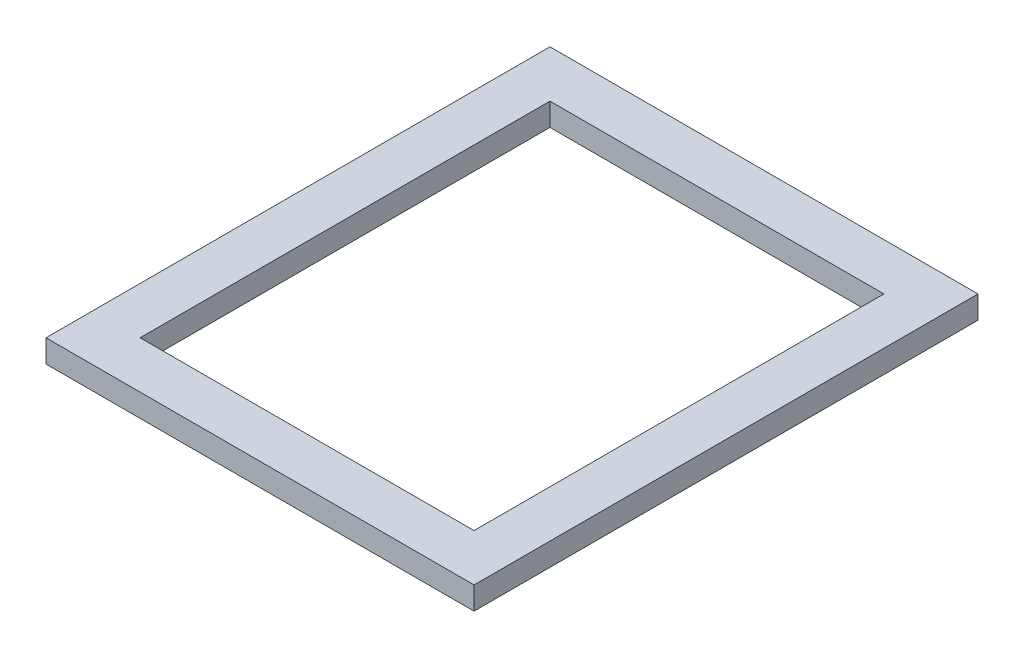
ISO-10303-21;
HEADER;
FILE_DESCRIPTION(('STEP AP214'),'2;1');
FILE_NAME('part.step','',(''),(''),'','','');
FILE_SCHEMA(('AUTOMOTIVE_DESIGN { 1 0 10303 214 1 1 1 1 }'));
ENDSEC;
DATA;
#1=APPLICATION_CONTEXT('core data for automotive mechanical design processes');
#2=APPLICATION_PROTOCOL_DEFINITION('international standard','automotive_design',2000,#1);
#3=PRODUCT_CONTEXT('',#1,'mechanical');
#4=PRODUCT('Part','Part','',(#3));
#5=PRODUCT_RELATED_PRODUCT_CATEGORY('part','',(#4));
#6=PRODUCT_DEFINITION_FORMATION('','',#4);
#7=PRODUCT_DEFINITION_CONTEXT('part definition',#1,'design');
#8=PRODUCT_DEFINITION('design','',#6,#7);
#9=PRODUCT_DEFINITION_SHAPE('','',#8);
#10=(LENGTH_UNIT() NAMED_UNIT(*) SI_UNIT(.MILLI.,.METRE.));
#11=(NAMED_UNIT(*) PLANE_ANGLE_UNIT() SI_UNIT($,.RADIAN.));
#12=(NAMED_UNIT(*) SI_UNIT($,.STERADIAN.) SOLID_ANGLE_UNIT());
#13=UNCERTAINTY_MEASURE_WITH_UNIT(LENGTH_MEASURE(1.E-05),#10,'distance_accuracy_value','');
#14=(GEOMETRIC_REPRESENTATION_CONTEXT(3) GLOBAL_UNCERTAINTY_ASSIGNED_CONTEXT((#13)) GLOBAL_UNIT_ASSIGNED_CONTEXT((#10,
#11,#12)) REPRESENTATION_CONTEXT('',''));
#15=CARTESIAN_POINT('',(0.,0.,0.));
#16=DIRECTION('',(0.,0.,1.));
#17=DIRECTION('',(1.,0.,0.));
#18=AXIS2_PLACEMENT_3D('',#15,#16,#17);
#19=CARTESIAN_POINT('',(0.,1.5,0.));
#20=DIRECTION('',(0.,1.,0.));
#21=DIRECTION('',(0.,0.,1.));
#22=AXIS2_PLACEMENT_3D('',#19,#20,#21);
#23=PLANE('',#22);
#24=DIRECTION('',(0.,0.,1.));
#25=VECTOR('',#24,1.);
#26=CARTESIAN_POINT('',(-14.1,1.5,-16.6));
#27=LINE('',#26,#25);
#28=CARTESIAN_POINT('',(-14.1,1.5,-16.6));
#29=VERTEX_POINT('',#28);
#30=CARTESIAN_POINT('',(-14.1,1.5,16.6));
#31=VERTEX_POINT('',#30);
#32=EDGE_CURVE('E145',#29,#31,#27,.T.);
#33=ORIENTED_EDGE('',*,*,#32,.T.);
#34=DIRECTION('',(1.,0.,0.));
#35=VECTOR('',#34,1.);
#36=CARTESIAN_POINT('',(-14.1,1.5,16.6));
#37=LINE('',#36,#35);
#38=CARTESIAN_POINT('',(14.1,1.5,16.6));
#39=VERTEX_POINT('',#38);
#40=EDGE_CURVE('E150',#31,#39,#37,.T.);
#41=ORIENTED_EDGE('',*,*,#40,.T.);
#42=DIRECTION('',(0.,0.,-1.));
#43=VECTOR('',#42,1.);
#44=CARTESIAN_POINT('',(14.1,1.5,16.6));
#45=LINE('',#44,#43);
#46=CARTESIAN_POINT('',(14.1,1.5,-16.6));
#47=VERTEX_POINT('',#46);
#48=EDGE_CURVE('E147',#39,#47,#45,.T.);
#49=ORIENTED_EDGE('',*,*,#48,.T.);
#50=DIRECTION('',(-1.,0.,0.));
#51=VECTOR('',#50,1.);
#52=CARTESIAN_POINT('',(14.1,1.5,-16.6));
#53=LINE('',#52,#51);
#54=EDGE_CURVE('E155',#47,#29,#53,.T.);
#55=ORIENTED_EDGE('',*,*,#54,.T.);
#56=EDGE_LOOP('',(#33,#41,#49,#55));
#57=FACE_BOUND('',#56,.T.);
#58=DIRECTION('',(1.,0.,0.));
#59=VECTOR('',#58,1.);
#60=CARTESIAN_POINT('',(-11.,1.5,13.5));
#61=LINE('',#60,#59);
#62=CARTESIAN_POINT('',(-11.,1.5,13.5));
#63=VERTEX_POINT('',#62);
#64=CARTESIAN_POINT('',(11.,1.5,13.5));
#65=VERTEX_POINT('',#64);
#66=EDGE_CURVE('E116',#63,#65,#61,.T.);
#67=ORIENTED_EDGE('',*,*,#66,.F.);
#68=DIRECTION('',(0.,0.,1.));
#69=VECTOR('',#68,1.);
#70=CARTESIAN_POINT('',(-11.,1.5,-13.5));
#71=LINE('',#70,#69);
#72=CARTESIAN_POINT('',(-11.,1.5,-13.5));
#73=VERTEX_POINT('',#72);
#74=EDGE_CURVE('E107',#73,#63,#71,.T.);
#75=ORIENTED_EDGE('',*,*,#74,.F.);
#76=DIRECTION('',(-1.,0.,0.));
#77=VECTOR('',#76,1.);
#78=CARTESIAN_POINT('',(11.,1.5,-13.5));
#79=LINE('',#78,#77);
#80=CARTESIAN_POINT('',(11.,1.5,-13.5));
#81=VERTEX_POINT('',#80);
#82=EDGE_CURVE('E128',#81,#73,#79,.T.);
#83=ORIENTED_EDGE('',*,*,#82,.F.);
#84=DIRECTION('',(0.,0.,-1.));
#85=VECTOR('',#84,1.);
#86=CARTESIAN_POINT('',(11.,1.5,13.5));
#87=LINE('',#86,#85);
#88=EDGE_CURVE('E126',#65,#81,#87,.T.);
#89=ORIENTED_EDGE('',*,*,#88,.F.);
#90=EDGE_LOOP('',(#67,#75,#83,#89));
#91=FACE_BOUND('',#90,.T.);
#92=ADVANCED_FACE('F43',(#57,#91),#23,.T.);
#93=CARTESIAN_POINT('',(0.,0.,0.));
#94=DIRECTION('',(0.,1.,0.));
#95=DIRECTION('',(0.,0.,1.));
#96=AXIS2_PLACEMENT_3D('',#93,#94,#95);
#97=PLANE('',#96);
#98=DIRECTION('',(0.,0.,1.));
#99=VECTOR('',#98,1.);
#100=CARTESIAN_POINT('',(-14.1,0.,-16.6));
#101=LINE('',#100,#99);
#102=CARTESIAN_POINT('',(-14.1,0.,-16.6));
#103=VERTEX_POINT('',#102);
#104=CARTESIAN_POINT('',(-14.1,0.,16.6));
#105=VERTEX_POINT('',#104);
#106=EDGE_CURVE('E122',#103,#105,#101,.T.);
#107=ORIENTED_EDGE('',*,*,#106,.F.);
#108=DIRECTION('',(-1.,0.,0.));
#109=VECTOR('',#108,1.);
#110=CARTESIAN_POINT('',(14.1,0.,-16.6));
#111=LINE('',#110,#109);
#112=CARTESIAN_POINT('',(14.1,0.,-16.6));
#113=VERTEX_POINT('',#112);
#114=EDGE_CURVE('E146',#113,#103,#111,.T.);
#115=ORIENTED_EDGE('',*,*,#114,.F.);
#116=DIRECTION('',(0.,0.,-1.));
#117=VECTOR('',#116,1.);
#118=CARTESIAN_POINT('',(14.1,0.,16.6));
#119=LINE('',#118,#117);
#120=CARTESIAN_POINT('',(14.1,0.,16.6));
#121=VERTEX_POINT('',#120);
#122=EDGE_CURVE('E157',#121,#113,#119,.T.);
#123=ORIENTED_EDGE('',*,*,#122,.F.);
#124=DIRECTION('',(1.,0.,0.));
#125=VECTOR('',#124,1.);
#126=CARTESIAN_POINT('',(-14.1,0.,16.6));
#127=LINE('',#126,#125);
#128=EDGE_CURVE('E160',#105,#121,#127,.T.);
#129=ORIENTED_EDGE('',*,*,#128,.F.);
#130=EDGE_LOOP('',(#107,#115,#123,#129));
#131=FACE_BOUND('',#130,.T.);
#132=DIRECTION('',(0.,0.,1.));
#133=VECTOR('',#132,1.);
#134=CARTESIAN_POINT('',(-11.,0.,-13.5));
#135=LINE('',#134,#133);
#136=CARTESIAN_POINT('',(-11.,0.,-13.5));
#137=VERTEX_POINT('',#136);
#138=CARTESIAN_POINT('',(-11.,0.,13.5));
#139=VERTEX_POINT('',#138);
#140=EDGE_CURVE('E66',#137,#139,#135,.T.);
#141=ORIENTED_EDGE('',*,*,#140,.T.);
#142=DIRECTION('',(1.,0.,0.));
#143=VECTOR('',#142,1.);
#144=CARTESIAN_POINT('',(-11.,0.,13.5));
#145=LINE('',#144,#143);
#146=CARTESIAN_POINT('',(11.,0.,13.5));
#147=VERTEX_POINT('',#146);
#148=EDGE_CURVE('E123',#139,#147,#145,.T.);
#149=ORIENTED_EDGE('',*,*,#148,.T.);
#150=DIRECTION('',(0.,0.,-1.));
#151=VECTOR('',#150,1.);
#152=CARTESIAN_POINT('',(11.,0.,13.5));
#153=LINE('',#152,#151);
#154=CARTESIAN_POINT('',(11.,0.,-13.5));
#155=VERTEX_POINT('',#154);
#156=EDGE_CURVE('E136',#147,#155,#153,.T.);
#157=ORIENTED_EDGE('',*,*,#156,.T.);
#158=DIRECTION('',(-1.,0.,0.));
#159=VECTOR('',#158,1.);
#160=CARTESIAN_POINT('',(11.,0.,-13.5));
#161=LINE('',#160,#159);
#162=EDGE_CURVE('E120',#155,#137,#161,.T.);
#163=ORIENTED_EDGE('',*,*,#162,.T.);
#164=EDGE_LOOP('',(#141,#149,#157,#163));
#165=FACE_BOUND('',#164,.T.);
#166=ADVANCED_FACE('F180',(#131,#165),#97,.F.);
#167=CARTESIAN_POINT('',(-14.1,1.5,-16.6));
#168=DIRECTION('',(1.,0.,0.));
#169=DIRECTION('',(0.,0.,-1.));
#170=AXIS2_PLACEMENT_3D('',#167,#168,#169);
#171=PLANE('',#170);
#172=ORIENTED_EDGE('',*,*,#106,.T.);
#173=DIRECTION('',(0.,-1.,0.));
#174=VECTOR('',#173,1.);
#175=CARTESIAN_POINT('',(-14.1,1.5,16.6));
#176=LINE('',#175,#174);
#177=EDGE_CURVE('E11',#31,#105,#176,.T.);
#178=ORIENTED_EDGE('',*,*,#177,.F.);
#179=ORIENTED_EDGE('',*,*,#32,.F.);
#180=DIRECTION('',(0.,-1.,0.));
#181=VECTOR('',#180,1.);
#182=CARTESIAN_POINT('',(-14.1,1.5,-16.6));
#183=LINE('',#182,#181);
#184=EDGE_CURVE('E152',#29,#103,#183,.T.);
#185=ORIENTED_EDGE('',*,*,#184,.T.);
#186=EDGE_LOOP('',(#172,#178,#179,#185));
#187=FACE_BOUND('',#186,.T.);
#188=ADVANCED_FACE('F44',(#187),#171,.F.);
#189=CARTESIAN_POINT('',(-14.1,1.5,16.6));
#190=DIRECTION('',(0.,0.,-1.));
#191=DIRECTION('',(-1.,0.,0.));
#192=AXIS2_PLACEMENT_3D('',#189,#190,#191);
#193=PLANE('',#192);
#194=ORIENTED_EDGE('',*,*,#128,.T.);
#195=DIRECTION('',(0.,-1.,0.));
#196=VECTOR('',#195,1.);
#197=CARTESIAN_POINT('',(14.1,1.5,16.6));
#198=LINE('',#197,#196);
#199=EDGE_CURVE('E51',#39,#121,#198,.T.);
#200=ORIENTED_EDGE('',*,*,#199,.F.);
#201=ORIENTED_EDGE('',*,*,#40,.F.);
#202=ORIENTED_EDGE('',*,*,#177,.T.);
#203=EDGE_LOOP('',(#194,#200,#201,#202));
#204=FACE_BOUND('',#203,.T.);
#205=ADVANCED_FACE('F190',(#204),#193,.F.);
#206=CARTESIAN_POINT('',(14.1,1.5,16.6));
#207=DIRECTION('',(-1.,0.,0.));
#208=DIRECTION('',(0.,0.,1.));
#209=AXIS2_PLACEMENT_3D('',#206,#207,#208);
#210=PLANE('',#209);
#211=ORIENTED_EDGE('',*,*,#122,.T.);
#212=DIRECTION('',(0.,-1.,0.));
#213=VECTOR('',#212,1.);
#214=CARTESIAN_POINT('',(14.1,1.5,-16.6));
#215=LINE('',#214,#213);
#216=EDGE_CURVE('E163',#47,#113,#215,.T.);
#217=ORIENTED_EDGE('',*,*,#216,.F.);
#218=ORIENTED_EDGE('',*,*,#48,.F.);
#219=ORIENTED_EDGE('',*,*,#199,.T.);
#220=EDGE_LOOP('',(#211,#217,#218,#219));
#221=FACE_BOUND('',#220,.T.);
#222=ADVANCED_FACE('F171',(#221),#210,.F.);
#223=CARTESIAN_POINT('',(14.1,1.5,-16.6));
#224=DIRECTION('',(0.,0.,1.));
#225=DIRECTION('',(1.,0.,0.));
#226=AXIS2_PLACEMENT_3D('',#223,#224,#225);
#227=PLANE('',#226);
#228=ORIENTED_EDGE('',*,*,#114,.T.);
#229=ORIENTED_EDGE('',*,*,#184,.F.);
#230=ORIENTED_EDGE('',*,*,#54,.F.);
#231=ORIENTED_EDGE('',*,*,#216,.T.);
#232=EDGE_LOOP('',(#228,#229,#230,#231));
#233=FACE_BOUND('',#232,.T.);
#234=ADVANCED_FACE('F182',(#233),#227,.F.);
#235=CARTESIAN_POINT('',(-11.,1.5,-13.5));
#236=DIRECTION('',(1.,0.,0.));
#237=DIRECTION('',(0.,0.,-1.));
#238=AXIS2_PLACEMENT_3D('',#235,#236,#237);
#239=PLANE('',#238);
#240=ORIENTED_EDGE('',*,*,#140,.F.);
#241=DIRECTION('',(0.,-1.,0.));
#242=VECTOR('',#241,1.);
#243=CARTESIAN_POINT('',(-11.,1.5,-13.5));
#244=LINE('',#243,#242);
#245=EDGE_CURVE('E115',#73,#137,#244,.T.);
#246=ORIENTED_EDGE('',*,*,#245,.F.);
#247=ORIENTED_EDGE('',*,*,#74,.T.);
#248=DIRECTION('',(0.,-1.,0.));
#249=VECTOR('',#248,1.);
#250=CARTESIAN_POINT('',(-11.,1.5,13.5));
#251=LINE('',#250,#249);
#252=EDGE_CURVE('E112',#63,#139,#251,.T.);
#253=ORIENTED_EDGE('',*,*,#252,.T.);
#254=EDGE_LOOP('',(#240,#246,#247,#253));
#255=FACE_BOUND('',#254,.T.);
#256=ADVANCED_FACE('F109',(#255),#239,.T.);
#257=CARTESIAN_POINT('',(-11.,1.5,13.5));
#258=DIRECTION('',(0.,0.,-1.));
#259=DIRECTION('',(-1.,0.,0.));
#260=AXIS2_PLACEMENT_3D('',#257,#258,#259);
#261=PLANE('',#260);
#262=ORIENTED_EDGE('',*,*,#148,.F.);
#263=ORIENTED_EDGE('',*,*,#252,.F.);
#264=ORIENTED_EDGE('',*,*,#66,.T.);
#265=DIRECTION('',(0.,-1.,0.));
#266=VECTOR('',#265,1.);
#267=CARTESIAN_POINT('',(11.,1.5,13.5));
#268=LINE('',#267,#266);
#269=EDGE_CURVE('E124',#65,#147,#268,.T.);
#270=ORIENTED_EDGE('',*,*,#269,.T.);
#271=EDGE_LOOP('',(#262,#263,#264,#270));
#272=FACE_BOUND('',#271,.T.);
#273=ADVANCED_FACE('F119',(#272),#261,.T.);
#274=CARTESIAN_POINT('',(11.,1.5,13.5));
#275=DIRECTION('',(-1.,0.,0.));
#276=DIRECTION('',(0.,0.,1.));
#277=AXIS2_PLACEMENT_3D('',#274,#275,#276);
#278=PLANE('',#277);
#279=ORIENTED_EDGE('',*,*,#156,.F.);
#280=ORIENTED_EDGE('',*,*,#269,.F.);
#281=ORIENTED_EDGE('',*,*,#88,.T.);
#282=DIRECTION('',(0.,-1.,0.));
#283=VECTOR('',#282,1.);
#284=CARTESIAN_POINT('',(11.,1.5,-13.5));
#285=LINE('',#284,#283);
#286=EDGE_CURVE('E59',#81,#155,#285,.T.);
#287=ORIENTED_EDGE('',*,*,#286,.T.);
#288=EDGE_LOOP('',(#279,#280,#281,#287));
#289=FACE_BOUND('',#288,.T.);
#290=ADVANCED_FACE('F209',(#289),#278,.T.);
#291=CARTESIAN_POINT('',(11.,1.5,-13.5));
#292=DIRECTION('',(0.,0.,1.));
#293=DIRECTION('',(1.,0.,0.));
#294=AXIS2_PLACEMENT_3D('',#291,#292,#293);
#295=PLANE('',#294);
#296=ORIENTED_EDGE('',*,*,#162,.F.);
#297=ORIENTED_EDGE('',*,*,#286,.F.);
#298=ORIENTED_EDGE('',*,*,#82,.T.);
#299=ORIENTED_EDGE('',*,*,#245,.T.);
#300=EDGE_LOOP('',(#296,#297,#298,#299));
#301=FACE_BOUND('',#300,.T.);
#302=ADVANCED_FACE('F212',(#301),#295,.T.);
#303=CLOSED_SHELL('',(#92,#166,#188,#205,#222,#234,#256,#273,#290,#302));
#304=MANIFOLD_SOLID_BREP('B2',#303);
#305=ADVANCED_BREP_SHAPE_REPRESENTATION('',(#18,#304),#14);
#306=SHAPE_DEFINITION_REPRESENTATION(#9,#305);
ENDSEC;
END-ISO-10303-21;
